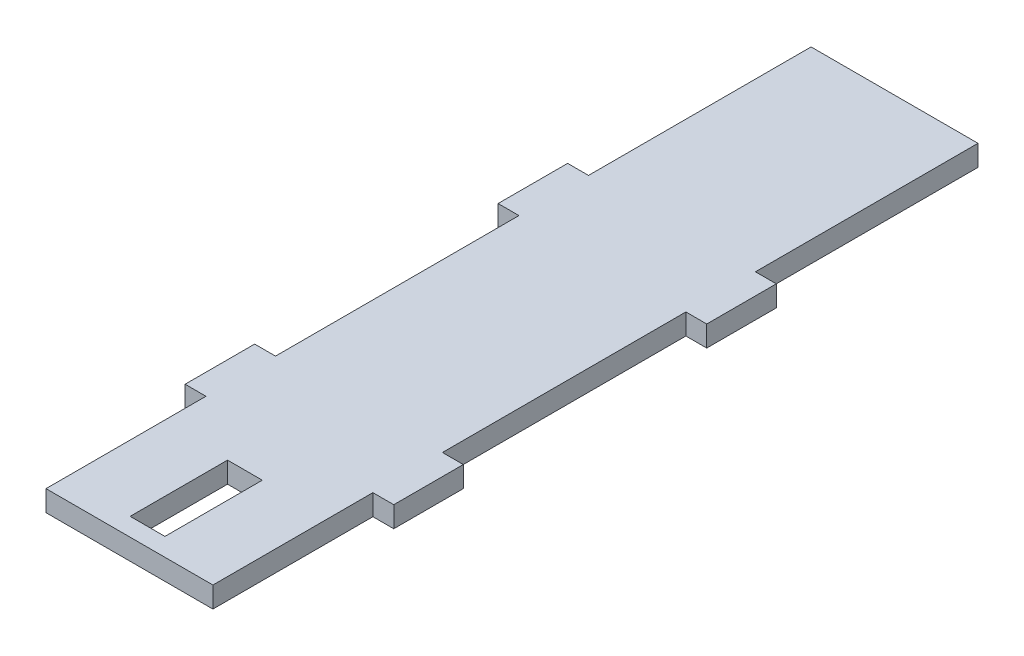
ISO-10303-21;
HEADER;
FILE_DESCRIPTION(('STEP AP214'),'2;1');
FILE_NAME('part.step','',(''),(''),'','','');
FILE_SCHEMA(('AUTOMOTIVE_DESIGN { 1 0 10303 214 1 1 1 1 }'));
ENDSEC;
DATA;
#1=APPLICATION_CONTEXT('core data for automotive mechanical design processes');
#2=APPLICATION_PROTOCOL_DEFINITION('international standard','automotive_design',2000,#1);
#3=PRODUCT_CONTEXT('',#1,'mechanical');
#4=PRODUCT('Part','Part','',(#3));
#5=PRODUCT_RELATED_PRODUCT_CATEGORY('part','',(#4));
#6=PRODUCT_DEFINITION_FORMATION('','',#4);
#7=PRODUCT_DEFINITION_CONTEXT('part definition',#1,'design');
#8=PRODUCT_DEFINITION('design','',#6,#7);
#9=PRODUCT_DEFINITION_SHAPE('','',#8);
#10=(LENGTH_UNIT() NAMED_UNIT(*) SI_UNIT(.MILLI.,.METRE.));
#11=(NAMED_UNIT(*) PLANE_ANGLE_UNIT() SI_UNIT($,.RADIAN.));
#12=(NAMED_UNIT(*) SI_UNIT($,.STERADIAN.) SOLID_ANGLE_UNIT());
#13=UNCERTAINTY_MEASURE_WITH_UNIT(LENGTH_MEASURE(1.E-05),#10,'distance_accuracy_value','');
#14=(GEOMETRIC_REPRESENTATION_CONTEXT(3) GLOBAL_UNCERTAINTY_ASSIGNED_CONTEXT((#13)) GLOBAL_UNIT_ASSIGNED_CONTEXT((#10,
#11,#12)) REPRESENTATION_CONTEXT('',''));
#15=CARTESIAN_POINT('',(0.,0.,0.));
#16=DIRECTION('',(0.,0.,1.));
#17=DIRECTION('',(1.,0.,0.));
#18=AXIS2_PLACEMENT_3D('',#15,#16,#17);
#19=CARTESIAN_POINT('',(12.,3.,-23.));
#20=DIRECTION('',(-1.,0.,0.));
#21=DIRECTION('',(0.,0.,1.));
#22=AXIS2_PLACEMENT_3D('',#19,#20,#21);
#23=PLANE('',#22);
#24=DIRECTION('',(0.,0.,-1.));
#25=VECTOR('',#24,1.);
#26=CARTESIAN_POINT('',(12.,0.,-23.));
#27=LINE('',#26,#25);
#28=CARTESIAN_POINT('',(12.,0.,-23.));
#29=VERTEX_POINT('',#28);
#30=CARTESIAN_POINT('',(12.,0.,-55.));
#31=VERTEX_POINT('',#30);
#32=EDGE_CURVE('E229',#29,#31,#27,.T.);
#33=ORIENTED_EDGE('',*,*,#32,.T.);
#34=DIRECTION('',(0.,-1.,0.));
#35=VECTOR('',#34,1.);
#36=CARTESIAN_POINT('',(12.,3.,-55.));
#37=LINE('',#36,#35);
#38=CARTESIAN_POINT('',(12.,3.,-55.));
#39=VERTEX_POINT('',#38);
#40=EDGE_CURVE('E431',#39,#31,#37,.T.);
#41=ORIENTED_EDGE('',*,*,#40,.F.);
#42=DIRECTION('',(0.,0.,-1.));
#43=VECTOR('',#42,1.);
#44=CARTESIAN_POINT('',(12.,3.,-23.));
#45=LINE('',#44,#43);
#46=CARTESIAN_POINT('',(12.,3.,-23.));
#47=VERTEX_POINT('',#46);
#48=EDGE_CURVE('E234',#47,#39,#45,.T.);
#49=ORIENTED_EDGE('',*,*,#48,.F.);
#50=DIRECTION('',(0.,-1.,0.));
#51=VECTOR('',#50,1.);
#52=CARTESIAN_POINT('',(12.,3.,-23.));
#53=LINE('',#52,#51);
#54=EDGE_CURVE('E296',#47,#29,#53,.T.);
#55=ORIENTED_EDGE('',*,*,#54,.T.);
#56=EDGE_LOOP('',(#33,#41,#49,#55));
#57=FACE_BOUND('',#56,.T.);
#58=ADVANCED_FACE('F38',(#57),#23,.F.);
#59=CARTESIAN_POINT('',(-12.,3.,-55.));
#60=DIRECTION('',(0.,0.,1.));
#61=DIRECTION('',(1.,0.,0.));
#62=AXIS2_PLACEMENT_3D('',#59,#60,#61);
#63=PLANE('',#62);
#64=DIRECTION('',(-1.,0.,0.));
#65=VECTOR('',#64,1.);
#66=CARTESIAN_POINT('',(-12.,0.,-55.));
#67=LINE('',#66,#65);
#68=CARTESIAN_POINT('',(-12.,0.,-55.));
#69=VERTEX_POINT('',#68);
#70=EDGE_CURVE('E300',#31,#69,#67,.T.);
#71=ORIENTED_EDGE('',*,*,#70,.T.);
#72=DIRECTION('',(0.,-1.,0.));
#73=VECTOR('',#72,1.);
#74=CARTESIAN_POINT('',(-12.,3.,-55.));
#75=LINE('',#74,#73);
#76=CARTESIAN_POINT('',(-12.,3.,-55.));
#77=VERTEX_POINT('',#76);
#78=EDGE_CURVE('E427',#77,#69,#75,.T.);
#79=ORIENTED_EDGE('',*,*,#78,.F.);
#80=DIRECTION('',(-1.,0.,0.));
#81=VECTOR('',#80,1.);
#82=CARTESIAN_POINT('',(-12.,3.,-55.));
#83=LINE('',#82,#81);
#84=EDGE_CURVE('E238',#39,#77,#83,.T.);
#85=ORIENTED_EDGE('',*,*,#84,.F.);
#86=ORIENTED_EDGE('',*,*,#40,.T.);
#87=EDGE_LOOP('',(#71,#79,#85,#86));
#88=FACE_BOUND('',#87,.T.);
#89=ADVANCED_FACE('F462',(#88),#63,.F.);
#90=CARTESIAN_POINT('',(-12.,3.,-23.));
#91=DIRECTION('',(1.,0.,0.));
#92=DIRECTION('',(0.,0.,-1.));
#93=AXIS2_PLACEMENT_3D('',#90,#91,#92);
#94=PLANE('',#93);
#95=DIRECTION('',(0.,0.,1.));
#96=VECTOR('',#95,1.);
#97=CARTESIAN_POINT('',(-12.,0.,-23.));
#98=LINE('',#97,#96);
#99=CARTESIAN_POINT('',(-12.,0.,-23.));
#100=VERTEX_POINT('',#99);
#101=EDGE_CURVE('E303',#69,#100,#98,.T.);
#102=ORIENTED_EDGE('',*,*,#101,.T.);
#103=DIRECTION('',(0.,-1.,0.));
#104=VECTOR('',#103,1.);
#105=CARTESIAN_POINT('',(-12.,3.,-23.));
#106=LINE('',#105,#104);
#107=CARTESIAN_POINT('',(-12.,3.,-23.));
#108=VERTEX_POINT('',#107);
#109=EDGE_CURVE('E423',#108,#100,#106,.T.);
#110=ORIENTED_EDGE('',*,*,#109,.F.);
#111=DIRECTION('',(0.,0.,1.));
#112=VECTOR('',#111,1.);
#113=CARTESIAN_POINT('',(-12.,3.,-23.));
#114=LINE('',#113,#112);
#115=EDGE_CURVE('E242',#77,#108,#114,.T.);
#116=ORIENTED_EDGE('',*,*,#115,.F.);
#117=ORIENTED_EDGE('',*,*,#78,.T.);
#118=EDGE_LOOP('',(#102,#110,#116,#117));
#119=FACE_BOUND('',#118,.T.);
#120=ADVANCED_FACE('F467',(#119),#94,.F.);
#121=CARTESIAN_POINT('',(-12.,3.,-23.));
#122=DIRECTION('',(0.,0.,1.));
#123=DIRECTION('',(1.,0.,0.));
#124=AXIS2_PLACEMENT_3D('',#121,#122,#123);
#125=PLANE('',#124);
#126=DIRECTION('',(-1.,0.,0.));
#127=VECTOR('',#126,1.);
#128=CARTESIAN_POINT('',(-12.,0.,-23.));
#129=LINE('',#128,#127);
#130=CARTESIAN_POINT('',(-15.,0.,-23.));
#131=VERTEX_POINT('',#130);
#132=EDGE_CURVE('E306',#100,#131,#129,.T.);
#133=ORIENTED_EDGE('',*,*,#132,.T.);
#134=DIRECTION('',(0.,-1.,0.));
#135=VECTOR('',#134,1.);
#136=CARTESIAN_POINT('',(-15.,3.,-23.));
#137=LINE('',#136,#135);
#138=CARTESIAN_POINT('',(-15.,3.,-23.));
#139=VERTEX_POINT('',#138);
#140=EDGE_CURVE('E419',#139,#131,#137,.T.);
#141=ORIENTED_EDGE('',*,*,#140,.F.);
#142=DIRECTION('',(-1.,0.,0.));
#143=VECTOR('',#142,1.);
#144=CARTESIAN_POINT('',(-12.,3.,-23.));
#145=LINE('',#144,#143);
#146=EDGE_CURVE('E245',#108,#139,#145,.T.);
#147=ORIENTED_EDGE('',*,*,#146,.F.);
#148=ORIENTED_EDGE('',*,*,#109,.T.);
#149=EDGE_LOOP('',(#133,#141,#147,#148));
#150=FACE_BOUND('',#149,.T.);
#151=ADVANCED_FACE('F559',(#150),#125,.F.);
#152=CARTESIAN_POINT('',(-15.,3.,-23.));
#153=DIRECTION('',(1.,0.,0.));
#154=DIRECTION('',(0.,0.,-1.));
#155=AXIS2_PLACEMENT_3D('',#152,#153,#154);
#156=PLANE('',#155);
#157=DIRECTION('',(0.,0.,1.));
#158=VECTOR('',#157,1.);
#159=CARTESIAN_POINT('',(-15.,0.,-23.));
#160=LINE('',#159,#158);
#161=CARTESIAN_POINT('',(-15.,0.,-13.));
#162=VERTEX_POINT('',#161);
#163=EDGE_CURVE('E309',#131,#162,#160,.T.);
#164=ORIENTED_EDGE('',*,*,#163,.T.);
#165=DIRECTION('',(0.,-1.,0.));
#166=VECTOR('',#165,1.);
#167=CARTESIAN_POINT('',(-15.,3.,-13.));
#168=LINE('',#167,#166);
#169=CARTESIAN_POINT('',(-15.,3.,-13.));
#170=VERTEX_POINT('',#169);
#171=EDGE_CURVE('E415',#170,#162,#168,.T.);
#172=ORIENTED_EDGE('',*,*,#171,.F.);
#173=DIRECTION('',(0.,0.,1.));
#174=VECTOR('',#173,1.);
#175=CARTESIAN_POINT('',(-15.,3.,-23.));
#176=LINE('',#175,#174);
#177=EDGE_CURVE('E248',#139,#170,#176,.T.);
#178=ORIENTED_EDGE('',*,*,#177,.F.);
#179=ORIENTED_EDGE('',*,*,#140,.T.);
#180=EDGE_LOOP('',(#164,#172,#178,#179));
#181=FACE_BOUND('',#180,.T.);
#182=ADVANCED_FACE('F555',(#181),#156,.F.);
#183=CARTESIAN_POINT('',(-12.,3.,-13.));
#184=DIRECTION('',(0.,0.,-1.));
#185=DIRECTION('',(-1.,0.,0.));
#186=AXIS2_PLACEMENT_3D('',#183,#184,#185);
#187=PLANE('',#186);
#188=DIRECTION('',(1.,0.,0.));
#189=VECTOR('',#188,1.);
#190=CARTESIAN_POINT('',(-12.,0.,-13.));
#191=LINE('',#190,#189);
#192=CARTESIAN_POINT('',(-12.,0.,-13.));
#193=VERTEX_POINT('',#192);
#194=EDGE_CURVE('E312',#162,#193,#191,.T.);
#195=ORIENTED_EDGE('',*,*,#194,.T.);
#196=DIRECTION('',(0.,-1.,0.));
#197=VECTOR('',#196,1.);
#198=CARTESIAN_POINT('',(-12.,3.,-13.));
#199=LINE('',#198,#197);
#200=CARTESIAN_POINT('',(-12.,3.,-13.));
#201=VERTEX_POINT('',#200);
#202=EDGE_CURVE('E411',#201,#193,#199,.T.);
#203=ORIENTED_EDGE('',*,*,#202,.F.);
#204=DIRECTION('',(1.,0.,0.));
#205=VECTOR('',#204,1.);
#206=CARTESIAN_POINT('',(-12.,3.,-13.));
#207=LINE('',#206,#205);
#208=EDGE_CURVE('E251',#170,#201,#207,.T.);
#209=ORIENTED_EDGE('',*,*,#208,.F.);
#210=ORIENTED_EDGE('',*,*,#171,.T.);
#211=EDGE_LOOP('',(#195,#203,#209,#210));
#212=FACE_BOUND('',#211,.T.);
#213=ADVANCED_FACE('F550',(#212),#187,.F.);
#214=CARTESIAN_POINT('',(-12.,3.,22.));
#215=DIRECTION('',(1.,0.,0.));
#216=DIRECTION('',(0.,0.,-1.));
#217=AXIS2_PLACEMENT_3D('',#214,#215,#216);
#218=PLANE('',#217);
#219=DIRECTION('',(0.,0.,1.));
#220=VECTOR('',#219,1.);
#221=CARTESIAN_POINT('',(-12.,0.,22.));
#222=LINE('',#221,#220);
#223=CARTESIAN_POINT('',(-12.,0.,22.));
#224=VERTEX_POINT('',#223);
#225=EDGE_CURVE('E315',#193,#224,#222,.T.);
#226=ORIENTED_EDGE('',*,*,#225,.T.);
#227=DIRECTION('',(0.,-1.,0.));
#228=VECTOR('',#227,1.);
#229=CARTESIAN_POINT('',(-12.,3.,22.));
#230=LINE('',#229,#228);
#231=CARTESIAN_POINT('',(-12.,3.,22.));
#232=VERTEX_POINT('',#231);
#233=EDGE_CURVE('E407',#232,#224,#230,.T.);
#234=ORIENTED_EDGE('',*,*,#233,.F.);
#235=DIRECTION('',(0.,0.,1.));
#236=VECTOR('',#235,1.);
#237=CARTESIAN_POINT('',(-12.,3.,22.));
#238=LINE('',#237,#236);
#239=EDGE_CURVE('E254',#201,#232,#238,.T.);
#240=ORIENTED_EDGE('',*,*,#239,.F.);
#241=ORIENTED_EDGE('',*,*,#202,.T.);
#242=EDGE_LOOP('',(#226,#234,#240,#241));
#243=FACE_BOUND('',#242,.T.);
#244=ADVANCED_FACE('F545',(#243),#218,.F.);
#245=CARTESIAN_POINT('',(-12.,3.,22.));
#246=DIRECTION('',(0.,0.,1.));
#247=DIRECTION('',(1.,0.,0.));
#248=AXIS2_PLACEMENT_3D('',#245,#246,#247);
#249=PLANE('',#248);
#250=DIRECTION('',(-1.,0.,0.));
#251=VECTOR('',#250,1.);
#252=CARTESIAN_POINT('',(-12.,0.,22.));
#253=LINE('',#252,#251);
#254=CARTESIAN_POINT('',(-15.,0.,22.));
#255=VERTEX_POINT('',#254);
#256=EDGE_CURVE('E318',#224,#255,#253,.T.);
#257=ORIENTED_EDGE('',*,*,#256,.T.);
#258=DIRECTION('',(0.,-1.,0.));
#259=VECTOR('',#258,1.);
#260=CARTESIAN_POINT('',(-15.,3.,22.));
#261=LINE('',#260,#259);
#262=CARTESIAN_POINT('',(-15.,3.,22.));
#263=VERTEX_POINT('',#262);
#264=EDGE_CURVE('E403',#263,#255,#261,.T.);
#265=ORIENTED_EDGE('',*,*,#264,.F.);
#266=DIRECTION('',(-1.,0.,0.));
#267=VECTOR('',#266,1.);
#268=CARTESIAN_POINT('',(-12.,3.,22.));
#269=LINE('',#268,#267);
#270=EDGE_CURVE('E257',#232,#263,#269,.T.);
#271=ORIENTED_EDGE('',*,*,#270,.F.);
#272=ORIENTED_EDGE('',*,*,#233,.T.);
#273=EDGE_LOOP('',(#257,#265,#271,#272));
#274=FACE_BOUND('',#273,.T.);
#275=ADVANCED_FACE('F541',(#274),#249,.F.);
#276=CARTESIAN_POINT('',(-15.,3.,22.));
#277=DIRECTION('',(1.,0.,0.));
#278=DIRECTION('',(0.,0.,-1.));
#279=AXIS2_PLACEMENT_3D('',#276,#277,#278);
#280=PLANE('',#279);
#281=DIRECTION('',(0.,0.,1.));
#282=VECTOR('',#281,1.);
#283=CARTESIAN_POINT('',(-15.,0.,22.));
#284=LINE('',#283,#282);
#285=CARTESIAN_POINT('',(-15.,0.,32.));
#286=VERTEX_POINT('',#285);
#287=EDGE_CURVE('E321',#255,#286,#284,.T.);
#288=ORIENTED_EDGE('',*,*,#287,.T.);
#289=DIRECTION('',(0.,-1.,0.));
#290=VECTOR('',#289,1.);
#291=CARTESIAN_POINT('',(-15.,3.,32.));
#292=LINE('',#291,#290);
#293=CARTESIAN_POINT('',(-15.,3.,32.));
#294=VERTEX_POINT('',#293);
#295=EDGE_CURVE('E399',#294,#286,#292,.T.);
#296=ORIENTED_EDGE('',*,*,#295,.F.);
#297=DIRECTION('',(0.,0.,1.));
#298=VECTOR('',#297,1.);
#299=CARTESIAN_POINT('',(-15.,3.,22.));
#300=LINE('',#299,#298);
#301=EDGE_CURVE('E260',#263,#294,#300,.T.);
#302=ORIENTED_EDGE('',*,*,#301,.F.);
#303=ORIENTED_EDGE('',*,*,#264,.T.);
#304=EDGE_LOOP('',(#288,#296,#302,#303));
#305=FACE_BOUND('',#304,.T.);
#306=ADVANCED_FACE('F536',(#305),#280,.F.);
#307=CARTESIAN_POINT('',(-12.,3.,32.));
#308=DIRECTION('',(0.,0.,-1.));
#309=DIRECTION('',(-1.,0.,0.));
#310=AXIS2_PLACEMENT_3D('',#307,#308,#309);
#311=PLANE('',#310);
#312=DIRECTION('',(1.,0.,0.));
#313=VECTOR('',#312,1.);
#314=CARTESIAN_POINT('',(-12.,0.,32.));
#315=LINE('',#314,#313);
#316=CARTESIAN_POINT('',(-12.,0.,32.));
#317=VERTEX_POINT('',#316);
#318=EDGE_CURVE('E324',#286,#317,#315,.T.);
#319=ORIENTED_EDGE('',*,*,#318,.T.);
#320=DIRECTION('',(0.,-1.,0.));
#321=VECTOR('',#320,1.);
#322=CARTESIAN_POINT('',(-12.,3.,32.));
#323=LINE('',#322,#321);
#324=CARTESIAN_POINT('',(-12.,3.,32.));
#325=VERTEX_POINT('',#324);
#326=EDGE_CURVE('E395',#325,#317,#323,.T.);
#327=ORIENTED_EDGE('',*,*,#326,.F.);
#328=DIRECTION('',(1.,0.,0.));
#329=VECTOR('',#328,1.);
#330=CARTESIAN_POINT('',(-12.,3.,32.));
#331=LINE('',#330,#329);
#332=EDGE_CURVE('E263',#294,#325,#331,.T.);
#333=ORIENTED_EDGE('',*,*,#332,.F.);
#334=ORIENTED_EDGE('',*,*,#295,.T.);
#335=EDGE_LOOP('',(#319,#327,#333,#334));
#336=FACE_BOUND('',#335,.T.);
#337=ADVANCED_FACE('F530',(#336),#311,.F.);
#338=CARTESIAN_POINT('',(-12.,3.,55.));
#339=DIRECTION('',(1.,0.,0.));
#340=DIRECTION('',(0.,0.,-1.));
#341=AXIS2_PLACEMENT_3D('',#338,#339,#340);
#342=PLANE('',#341);
#343=DIRECTION('',(0.,0.,1.));
#344=VECTOR('',#343,1.);
#345=CARTESIAN_POINT('',(-12.,0.,55.));
#346=LINE('',#345,#344);
#347=CARTESIAN_POINT('',(-12.,0.,55.));
#348=VERTEX_POINT('',#347);
#349=EDGE_CURVE('E327',#317,#348,#346,.T.);
#350=ORIENTED_EDGE('',*,*,#349,.T.);
#351=DIRECTION('',(0.,-1.,0.));
#352=VECTOR('',#351,1.);
#353=CARTESIAN_POINT('',(-12.,3.,55.));
#354=LINE('',#353,#352);
#355=CARTESIAN_POINT('',(-12.,3.,55.));
#356=VERTEX_POINT('',#355);
#357=EDGE_CURVE('E391',#356,#348,#354,.T.);
#358=ORIENTED_EDGE('',*,*,#357,.F.);
#359=DIRECTION('',(0.,0.,1.));
#360=VECTOR('',#359,1.);
#361=CARTESIAN_POINT('',(-12.,3.,55.));
#362=LINE('',#361,#360);
#363=EDGE_CURVE('E266',#325,#356,#362,.T.);
#364=ORIENTED_EDGE('',*,*,#363,.F.);
#365=ORIENTED_EDGE('',*,*,#326,.T.);
#366=EDGE_LOOP('',(#350,#358,#364,#365));
#367=FACE_BOUND('',#366,.T.);
#368=ADVANCED_FACE('F526',(#367),#342,.F.);
#369=CARTESIAN_POINT('',(-12.,3.,55.));
#370=DIRECTION('',(0.,0.,-1.));
#371=DIRECTION('',(-1.,0.,0.));
#372=AXIS2_PLACEMENT_3D('',#369,#370,#371);
#373=PLANE('',#372);
#374=DIRECTION('',(1.,0.,0.));
#375=VECTOR('',#374,1.);
#376=CARTESIAN_POINT('',(-12.,0.,55.));
#377=LINE('',#376,#375);
#378=CARTESIAN_POINT('',(12.,0.,55.));
#379=VERTEX_POINT('',#378);
#380=EDGE_CURVE('E330',#348,#379,#377,.T.);
#381=ORIENTED_EDGE('',*,*,#380,.T.);
#382=DIRECTION('',(0.,-1.,0.));
#383=VECTOR('',#382,1.);
#384=CARTESIAN_POINT('',(12.,3.,55.));
#385=LINE('',#384,#383);
#386=CARTESIAN_POINT('',(12.,3.,55.));
#387=VERTEX_POINT('',#386);
#388=EDGE_CURVE('E387',#387,#379,#385,.T.);
#389=ORIENTED_EDGE('',*,*,#388,.F.);
#390=DIRECTION('',(1.,0.,0.));
#391=VECTOR('',#390,1.);
#392=CARTESIAN_POINT('',(-12.,3.,55.));
#393=LINE('',#392,#391);
#394=EDGE_CURVE('E269',#356,#387,#393,.T.);
#395=ORIENTED_EDGE('',*,*,#394,.F.);
#396=ORIENTED_EDGE('',*,*,#357,.T.);
#397=EDGE_LOOP('',(#381,#389,#395,#396));
#398=FACE_BOUND('',#397,.T.);
#399=ADVANCED_FACE('F521',(#398),#373,.F.);
#400=CARTESIAN_POINT('',(12.,3.,55.));
#401=DIRECTION('',(-1.,0.,0.));
#402=DIRECTION('',(0.,0.,1.));
#403=AXIS2_PLACEMENT_3D('',#400,#401,#402);
#404=PLANE('',#403);
#405=DIRECTION('',(0.,0.,-1.));
#406=VECTOR('',#405,1.);
#407=CARTESIAN_POINT('',(12.,0.,55.));
#408=LINE('',#407,#406);
#409=CARTESIAN_POINT('',(12.,0.,32.));
#410=VERTEX_POINT('',#409);
#411=EDGE_CURVE('E333',#379,#410,#408,.T.);
#412=ORIENTED_EDGE('',*,*,#411,.T.);
#413=DIRECTION('',(0.,-1.,0.));
#414=VECTOR('',#413,1.);
#415=CARTESIAN_POINT('',(12.,3.,32.));
#416=LINE('',#415,#414);
#417=CARTESIAN_POINT('',(12.,3.,32.));
#418=VERTEX_POINT('',#417);
#419=EDGE_CURVE('E383',#418,#410,#416,.T.);
#420=ORIENTED_EDGE('',*,*,#419,.F.);
#421=DIRECTION('',(0.,0.,-1.));
#422=VECTOR('',#421,1.);
#423=CARTESIAN_POINT('',(12.,3.,55.));
#424=LINE('',#423,#422);
#425=EDGE_CURVE('E272',#387,#418,#424,.T.);
#426=ORIENTED_EDGE('',*,*,#425,.F.);
#427=ORIENTED_EDGE('',*,*,#388,.T.);
#428=EDGE_LOOP('',(#412,#420,#426,#427));
#429=FACE_BOUND('',#428,.T.);
#430=ADVANCED_FACE('F515',(#429),#404,.F.);
#431=CARTESIAN_POINT('',(12.,3.,32.));
#432=DIRECTION('',(0.,0.,-1.));
#433=DIRECTION('',(-1.,0.,0.));
#434=AXIS2_PLACEMENT_3D('',#431,#432,#433);
#435=PLANE('',#434);
#436=DIRECTION('',(1.,0.,0.));
#437=VECTOR('',#436,1.);
#438=CARTESIAN_POINT('',(12.,0.,32.));
#439=LINE('',#438,#437);
#440=CARTESIAN_POINT('',(15.,0.,32.));
#441=VERTEX_POINT('',#440);
#442=EDGE_CURVE('E336',#410,#441,#439,.T.);
#443=ORIENTED_EDGE('',*,*,#442,.T.);
#444=DIRECTION('',(0.,-1.,0.));
#445=VECTOR('',#444,1.);
#446=CARTESIAN_POINT('',(15.,3.,32.));
#447=LINE('',#446,#445);
#448=CARTESIAN_POINT('',(15.,3.,32.));
#449=VERTEX_POINT('',#448);
#450=EDGE_CURVE('E379',#449,#441,#447,.T.);
#451=ORIENTED_EDGE('',*,*,#450,.F.);
#452=DIRECTION('',(1.,0.,0.));
#453=VECTOR('',#452,1.);
#454=CARTESIAN_POINT('',(12.,3.,32.));
#455=LINE('',#454,#453);
#456=EDGE_CURVE('E275',#418,#449,#455,.T.);
#457=ORIENTED_EDGE('',*,*,#456,.F.);
#458=ORIENTED_EDGE('',*,*,#419,.T.);
#459=EDGE_LOOP('',(#443,#451,#457,#458));
#460=FACE_BOUND('',#459,.T.);
#461=ADVANCED_FACE('F511',(#460),#435,.F.);
#462=CARTESIAN_POINT('',(15.,3.,22.));
#463=DIRECTION('',(-1.,0.,0.));
#464=DIRECTION('',(0.,0.,1.));
#465=AXIS2_PLACEMENT_3D('',#462,#463,#464);
#466=PLANE('',#465);
#467=DIRECTION('',(0.,0.,-1.));
#468=VECTOR('',#467,1.);
#469=CARTESIAN_POINT('',(15.,0.,22.));
#470=LINE('',#469,#468);
#471=CARTESIAN_POINT('',(15.,0.,22.));
#472=VERTEX_POINT('',#471);
#473=EDGE_CURVE('E339',#441,#472,#470,.T.);
#474=ORIENTED_EDGE('',*,*,#473,.T.);
#475=DIRECTION('',(0.,-1.,0.));
#476=VECTOR('',#475,1.);
#477=CARTESIAN_POINT('',(15.,3.,22.));
#478=LINE('',#477,#476);
#479=CARTESIAN_POINT('',(15.,3.,22.));
#480=VERTEX_POINT('',#479);
#481=EDGE_CURVE('E375',#480,#472,#478,.T.);
#482=ORIENTED_EDGE('',*,*,#481,.F.);
#483=DIRECTION('',(0.,0.,-1.));
#484=VECTOR('',#483,1.);
#485=CARTESIAN_POINT('',(15.,3.,22.));
#486=LINE('',#485,#484);
#487=EDGE_CURVE('E278',#449,#480,#486,.T.);
#488=ORIENTED_EDGE('',*,*,#487,.F.);
#489=ORIENTED_EDGE('',*,*,#450,.T.);
#490=EDGE_LOOP('',(#474,#482,#488,#489));
#491=FACE_BOUND('',#490,.T.);
#492=ADVANCED_FACE('F506',(#491),#466,.F.);
#493=CARTESIAN_POINT('',(12.,3.,22.));
#494=DIRECTION('',(0.,0.,1.));
#495=DIRECTION('',(1.,0.,0.));
#496=AXIS2_PLACEMENT_3D('',#493,#494,#495);
#497=PLANE('',#496);
#498=DIRECTION('',(-1.,0.,0.));
#499=VECTOR('',#498,1.);
#500=CARTESIAN_POINT('',(12.,0.,22.));
#501=LINE('',#500,#499);
#502=CARTESIAN_POINT('',(12.,0.,22.));
#503=VERTEX_POINT('',#502);
#504=EDGE_CURVE('E342',#472,#503,#501,.T.);
#505=ORIENTED_EDGE('',*,*,#504,.T.);
#506=DIRECTION('',(0.,-1.,0.));
#507=VECTOR('',#506,1.);
#508=CARTESIAN_POINT('',(12.,3.,22.));
#509=LINE('',#508,#507);
#510=CARTESIAN_POINT('',(12.,3.,22.));
#511=VERTEX_POINT('',#510);
#512=EDGE_CURVE('E371',#511,#503,#509,.T.);
#513=ORIENTED_EDGE('',*,*,#512,.F.);
#514=DIRECTION('',(-1.,0.,0.));
#515=VECTOR('',#514,1.);
#516=CARTESIAN_POINT('',(12.,3.,22.));
#517=LINE('',#516,#515);
#518=EDGE_CURVE('E281',#480,#511,#517,.T.);
#519=ORIENTED_EDGE('',*,*,#518,.F.);
#520=ORIENTED_EDGE('',*,*,#481,.T.);
#521=EDGE_LOOP('',(#505,#513,#519,#520));
#522=FACE_BOUND('',#521,.T.);
#523=ADVANCED_FACE('F500',(#522),#497,.F.);
#524=CARTESIAN_POINT('',(12.,3.,22.));
#525=DIRECTION('',(-1.,0.,0.));
#526=DIRECTION('',(0.,0.,1.));
#527=AXIS2_PLACEMENT_3D('',#524,#525,#526);
#528=PLANE('',#527);
#529=DIRECTION('',(0.,0.,-1.));
#530=VECTOR('',#529,1.);
#531=CARTESIAN_POINT('',(12.,0.,22.));
#532=LINE('',#531,#530);
#533=CARTESIAN_POINT('',(12.,0.,-13.));
#534=VERTEX_POINT('',#533);
#535=EDGE_CURVE('E345',#503,#534,#532,.T.);
#536=ORIENTED_EDGE('',*,*,#535,.T.);
#537=DIRECTION('',(0.,-1.,0.));
#538=VECTOR('',#537,1.);
#539=CARTESIAN_POINT('',(12.,3.,-13.));
#540=LINE('',#539,#538);
#541=CARTESIAN_POINT('',(12.,3.,-13.));
#542=VERTEX_POINT('',#541);
#543=EDGE_CURVE('E367',#542,#534,#540,.T.);
#544=ORIENTED_EDGE('',*,*,#543,.F.);
#545=DIRECTION('',(0.,0.,-1.));
#546=VECTOR('',#545,1.);
#547=CARTESIAN_POINT('',(12.,3.,22.));
#548=LINE('',#547,#546);
#549=EDGE_CURVE('E284',#511,#542,#548,.T.);
#550=ORIENTED_EDGE('',*,*,#549,.F.);
#551=ORIENTED_EDGE('',*,*,#512,.T.);
#552=EDGE_LOOP('',(#536,#544,#550,#551));
#553=FACE_BOUND('',#552,.T.);
#554=ADVANCED_FACE('F496',(#553),#528,.F.);
#555=CARTESIAN_POINT('',(12.,3.,-13.));
#556=DIRECTION('',(0.,0.,-1.));
#557=DIRECTION('',(-1.,0.,0.));
#558=AXIS2_PLACEMENT_3D('',#555,#556,#557);
#559=PLANE('',#558);
#560=DIRECTION('',(1.,0.,0.));
#561=VECTOR('',#560,1.);
#562=CARTESIAN_POINT('',(12.,0.,-13.));
#563=LINE('',#562,#561);
#564=CARTESIAN_POINT('',(15.,0.,-13.));
#565=VERTEX_POINT('',#564);
#566=EDGE_CURVE('E348',#534,#565,#563,.T.);
#567=ORIENTED_EDGE('',*,*,#566,.T.);
#568=DIRECTION('',(0.,-1.,0.));
#569=VECTOR('',#568,1.);
#570=CARTESIAN_POINT('',(15.,3.,-13.));
#571=LINE('',#570,#569);
#572=CARTESIAN_POINT('',(15.,3.,-13.));
#573=VERTEX_POINT('',#572);
#574=EDGE_CURVE('E363',#573,#565,#571,.T.);
#575=ORIENTED_EDGE('',*,*,#574,.F.);
#576=DIRECTION('',(1.,0.,0.));
#577=VECTOR('',#576,1.);
#578=CARTESIAN_POINT('',(12.,3.,-13.));
#579=LINE('',#578,#577);
#580=EDGE_CURVE('E287',#542,#573,#579,.T.);
#581=ORIENTED_EDGE('',*,*,#580,.F.);
#582=ORIENTED_EDGE('',*,*,#543,.T.);
#583=EDGE_LOOP('',(#567,#575,#581,#582));
#584=FACE_BOUND('',#583,.T.);
#585=ADVANCED_FACE('F491',(#584),#559,.F.);
#586=CARTESIAN_POINT('',(15.,3.,-23.));
#587=DIRECTION('',(-1.,0.,0.));
#588=DIRECTION('',(0.,0.,1.));
#589=AXIS2_PLACEMENT_3D('',#586,#587,#588);
#590=PLANE('',#589);
#591=DIRECTION('',(0.,0.,-1.));
#592=VECTOR('',#591,1.);
#593=CARTESIAN_POINT('',(15.,0.,-23.));
#594=LINE('',#593,#592);
#595=CARTESIAN_POINT('',(15.,0.,-23.));
#596=VERTEX_POINT('',#595);
#597=EDGE_CURVE('E351',#565,#596,#594,.T.);
#598=ORIENTED_EDGE('',*,*,#597,.T.);
#599=DIRECTION('',(0.,-1.,0.));
#600=VECTOR('',#599,1.);
#601=CARTESIAN_POINT('',(15.,3.,-23.));
#602=LINE('',#601,#600);
#603=CARTESIAN_POINT('',(15.,3.,-23.));
#604=VERTEX_POINT('',#603);
#605=EDGE_CURVE('E359',#604,#596,#602,.T.);
#606=ORIENTED_EDGE('',*,*,#605,.F.);
#607=DIRECTION('',(0.,0.,-1.));
#608=VECTOR('',#607,1.);
#609=CARTESIAN_POINT('',(15.,3.,-23.));
#610=LINE('',#609,#608);
#611=EDGE_CURVE('E290',#573,#604,#610,.T.);
#612=ORIENTED_EDGE('',*,*,#611,.F.);
#613=ORIENTED_EDGE('',*,*,#574,.T.);
#614=EDGE_LOOP('',(#598,#606,#612,#613));
#615=FACE_BOUND('',#614,.T.);
#616=ADVANCED_FACE('F485',(#615),#590,.F.);
#617=CARTESIAN_POINT('',(12.,3.,-23.));
#618=DIRECTION('',(0.,0.,1.));
#619=DIRECTION('',(1.,0.,0.));
#620=AXIS2_PLACEMENT_3D('',#617,#618,#619);
#621=PLANE('',#620);
#622=DIRECTION('',(-1.,0.,0.));
#623=VECTOR('',#622,1.);
#624=CARTESIAN_POINT('',(12.,0.,-23.));
#625=LINE('',#624,#623);
#626=EDGE_CURVE('E239',#596,#29,#625,.T.);
#627=ORIENTED_EDGE('',*,*,#626,.T.);
#628=ORIENTED_EDGE('',*,*,#54,.F.);
#629=DIRECTION('',(-1.,0.,0.));
#630=VECTOR('',#629,1.);
#631=CARTESIAN_POINT('',(12.,3.,-23.));
#632=LINE('',#631,#630);
#633=EDGE_CURVE('E293',#604,#47,#632,.T.);
#634=ORIENTED_EDGE('',*,*,#633,.F.);
#635=ORIENTED_EDGE('',*,*,#605,.T.);
#636=EDGE_LOOP('',(#627,#628,#634,#635));
#637=FACE_BOUND('',#636,.T.);
#638=ADVANCED_FACE('F483',(#637),#621,.F.);
#639=CARTESIAN_POINT('',(0.,3.,0.));
#640=DIRECTION('',(0.,-1.,0.));
#641=DIRECTION('',(0.,0.,-1.));
#642=AXIS2_PLACEMENT_3D('',#639,#640,#641);
#643=PLANE('',#642);
#644=DIRECTION('',(1.,0.,0.));
#645=VECTOR('',#644,1.);
#646=CARTESIAN_POINT('',(-2.5,3.,52.4));
#647=LINE('',#646,#645);
#648=CARTESIAN_POINT('',(-2.5,3.,52.4));
#649=VERTEX_POINT('',#648);
#650=CARTESIAN_POINT('',(2.5,3.,52.4));
#651=VERTEX_POINT('',#650);
#652=EDGE_CURVE('E211',#649,#651,#647,.T.);
#653=ORIENTED_EDGE('',*,*,#652,.F.);
#654=DIRECTION('',(0.,0.,1.));
#655=VECTOR('',#654,1.);
#656=CARTESIAN_POINT('',(-2.5,3.,52.4));
#657=LINE('',#656,#655);
#658=CARTESIAN_POINT('',(-2.5,3.,38.4));
#659=VERTEX_POINT('',#658);
#660=EDGE_CURVE('E53',#659,#649,#657,.T.);
#661=ORIENTED_EDGE('',*,*,#660,.F.);
#662=DIRECTION('',(-1.,0.,0.));
#663=VECTOR('',#662,1.);
#664=CARTESIAN_POINT('',(-2.5,3.,38.4));
#665=LINE('',#664,#663);
#666=CARTESIAN_POINT('',(2.5,3.,38.4));
#667=VERTEX_POINT('',#666);
#668=EDGE_CURVE('E219',#667,#659,#665,.T.);
#669=ORIENTED_EDGE('',*,*,#668,.F.);
#670=DIRECTION('',(0.,0.,-1.));
#671=VECTOR('',#670,1.);
#672=CARTESIAN_POINT('',(2.5,3.,52.4));
#673=LINE('',#672,#671);
#674=EDGE_CURVE('E201',#651,#667,#673,.T.);
#675=ORIENTED_EDGE('',*,*,#674,.F.);
#676=EDGE_LOOP('',(#653,#661,#669,#675));
#677=FACE_BOUND('',#676,.T.);
#678=ORIENTED_EDGE('',*,*,#48,.T.);
#679=ORIENTED_EDGE('',*,*,#84,.T.);
#680=ORIENTED_EDGE('',*,*,#115,.T.);
#681=ORIENTED_EDGE('',*,*,#146,.T.);
#682=ORIENTED_EDGE('',*,*,#177,.T.);
#683=ORIENTED_EDGE('',*,*,#208,.T.);
#684=ORIENTED_EDGE('',*,*,#239,.T.);
#685=ORIENTED_EDGE('',*,*,#270,.T.);
#686=ORIENTED_EDGE('',*,*,#301,.T.);
#687=ORIENTED_EDGE('',*,*,#332,.T.);
#688=ORIENTED_EDGE('',*,*,#363,.T.);
#689=ORIENTED_EDGE('',*,*,#394,.T.);
#690=ORIENTED_EDGE('',*,*,#425,.T.);
#691=ORIENTED_EDGE('',*,*,#456,.T.);
#692=ORIENTED_EDGE('',*,*,#487,.T.);
#693=ORIENTED_EDGE('',*,*,#518,.T.);
#694=ORIENTED_EDGE('',*,*,#549,.T.);
#695=ORIENTED_EDGE('',*,*,#580,.T.);
#696=ORIENTED_EDGE('',*,*,#611,.T.);
#697=ORIENTED_EDGE('',*,*,#633,.T.);
#698=EDGE_LOOP('',(#678,#679,#680,#681,#682,#683,#684,#685,#686,#687,#688,#689,#690,#691,#692,
#693,#694,#695,#696,#697));
#699=FACE_BOUND('',#698,.T.);
#700=ADVANCED_FACE('F216',(#677,#699),#643,.F.);
#701=CARTESIAN_POINT('',(0.,0.,0.));
#702=DIRECTION('',(0.,-1.,0.));
#703=DIRECTION('',(0.,0.,-1.));
#704=AXIS2_PLACEMENT_3D('',#701,#702,#703);
#705=PLANE('',#704);
#706=DIRECTION('',(0.,0.,-1.));
#707=VECTOR('',#706,1.);
#708=CARTESIAN_POINT('',(-2.5,0.,0.));
#709=LINE('',#708,#707);
#710=CARTESIAN_POINT('',(-2.5,0.,52.4));
#711=VERTEX_POINT('',#710);
#712=CARTESIAN_POINT('',(-2.5,0.,38.4));
#713=VERTEX_POINT('',#712);
#714=EDGE_CURVE('E11',#711,#713,#709,.T.);
#715=ORIENTED_EDGE('',*,*,#714,.F.);
#716=DIRECTION('',(-1.,0.,0.));
#717=VECTOR('',#716,1.);
#718=CARTESIAN_POINT('',(0.,0.,52.4));
#719=LINE('',#718,#717);
#720=CARTESIAN_POINT('',(2.5,0.,52.4));
#721=VERTEX_POINT('',#720);
#722=EDGE_CURVE('E435',#721,#711,#719,.T.);
#723=ORIENTED_EDGE('',*,*,#722,.F.);
#724=DIRECTION('',(0.,0.,1.));
#725=VECTOR('',#724,1.);
#726=CARTESIAN_POINT('',(2.5,0.,0.));
#727=LINE('',#726,#725);
#728=CARTESIAN_POINT('',(2.5,0.,38.4));
#729=VERTEX_POINT('',#728);
#730=EDGE_CURVE('E204',#729,#721,#727,.T.);
#731=ORIENTED_EDGE('',*,*,#730,.F.);
#732=DIRECTION('',(1.,0.,0.));
#733=VECTOR('',#732,1.);
#734=CARTESIAN_POINT('',(0.,0.,38.4));
#735=LINE('',#734,#733);
#736=EDGE_CURVE('E46',#713,#729,#735,.T.);
#737=ORIENTED_EDGE('',*,*,#736,.F.);
#738=EDGE_LOOP('',(#715,#723,#731,#737));
#739=FACE_BOUND('',#738,.T.);
#740=ORIENTED_EDGE('',*,*,#32,.F.);
#741=ORIENTED_EDGE('',*,*,#626,.F.);
#742=ORIENTED_EDGE('',*,*,#597,.F.);
#743=ORIENTED_EDGE('',*,*,#566,.F.);
#744=ORIENTED_EDGE('',*,*,#535,.F.);
#745=ORIENTED_EDGE('',*,*,#504,.F.);
#746=ORIENTED_EDGE('',*,*,#473,.F.);
#747=ORIENTED_EDGE('',*,*,#442,.F.);
#748=ORIENTED_EDGE('',*,*,#411,.F.);
#749=ORIENTED_EDGE('',*,*,#380,.F.);
#750=ORIENTED_EDGE('',*,*,#349,.F.);
#751=ORIENTED_EDGE('',*,*,#318,.F.);
#752=ORIENTED_EDGE('',*,*,#287,.F.);
#753=ORIENTED_EDGE('',*,*,#256,.F.);
#754=ORIENTED_EDGE('',*,*,#225,.F.);
#755=ORIENTED_EDGE('',*,*,#194,.F.);
#756=ORIENTED_EDGE('',*,*,#163,.F.);
#757=ORIENTED_EDGE('',*,*,#132,.F.);
#758=ORIENTED_EDGE('',*,*,#101,.F.);
#759=ORIENTED_EDGE('',*,*,#70,.F.);
#760=EDGE_LOOP('',(#740,#741,#742,#743,#744,#745,#746,#747,#748,#749,#750,#751,#752,#753,#754,
#755,#756,#757,#758,#759));
#761=FACE_BOUND('',#760,.T.);
#762=ADVANCED_FACE('F446',(#739,#761),#705,.T.);
#763=CARTESIAN_POINT('',(-2.5,-7.,52.4));
#764=DIRECTION('',(-1.,0.,0.));
#765=DIRECTION('',(0.,0.,1.));
#766=AXIS2_PLACEMENT_3D('',#763,#764,#765);
#767=PLANE('',#766);
#768=ORIENTED_EDGE('',*,*,#714,.T.);
#769=DIRECTION('',(0.,1.,0.));
#770=VECTOR('',#769,1.);
#771=CARTESIAN_POINT('',(-2.5,-7.,38.4));
#772=LINE('',#771,#770);
#773=EDGE_CURVE('E226',#713,#659,#772,.T.);
#774=ORIENTED_EDGE('',*,*,#773,.T.);
#775=ORIENTED_EDGE('',*,*,#660,.T.);
#776=DIRECTION('',(0.,1.,0.));
#777=VECTOR('',#776,1.);
#778=CARTESIAN_POINT('',(-2.5,-7.,52.4));
#779=LINE('',#778,#777);
#780=EDGE_CURVE('E208',#711,#649,#779,.T.);
#781=ORIENTED_EDGE('',*,*,#780,.F.);
#782=EDGE_LOOP('',(#768,#774,#775,#781));
#783=FACE_BOUND('',#782,.T.);
#784=ADVANCED_FACE('F448',(#783),#767,.F.);
#785=CARTESIAN_POINT('',(-2.5,-7.,38.4));
#786=DIRECTION('',(0.,0.,-1.));
#787=DIRECTION('',(-1.,0.,0.));
#788=AXIS2_PLACEMENT_3D('',#785,#786,#787);
#789=PLANE('',#788);
#790=ORIENTED_EDGE('',*,*,#736,.T.);
#791=DIRECTION('',(0.,1.,0.));
#792=VECTOR('',#791,1.);
#793=CARTESIAN_POINT('',(2.5,-7.,38.4));
#794=LINE('',#793,#792);
#795=EDGE_CURVE('E207',#729,#667,#794,.T.);
#796=ORIENTED_EDGE('',*,*,#795,.T.);
#797=ORIENTED_EDGE('',*,*,#668,.T.);
#798=ORIENTED_EDGE('',*,*,#773,.F.);
#799=EDGE_LOOP('',(#790,#796,#797,#798));
#800=FACE_BOUND('',#799,.T.);
#801=ADVANCED_FACE('F443',(#800),#789,.F.);
#802=CARTESIAN_POINT('',(2.5,-7.,52.4));
#803=DIRECTION('',(1.,0.,0.));
#804=DIRECTION('',(0.,0.,-1.));
#805=AXIS2_PLACEMENT_3D('',#802,#803,#804);
#806=PLANE('',#805);
#807=ORIENTED_EDGE('',*,*,#730,.T.);
#808=DIRECTION('',(0.,1.,0.));
#809=VECTOR('',#808,1.);
#810=CARTESIAN_POINT('',(2.5,-7.,52.4));
#811=LINE('',#810,#809);
#812=EDGE_CURVE('E61',#721,#651,#811,.T.);
#813=ORIENTED_EDGE('',*,*,#812,.T.);
#814=ORIENTED_EDGE('',*,*,#674,.T.);
#815=ORIENTED_EDGE('',*,*,#795,.F.);
#816=EDGE_LOOP('',(#807,#813,#814,#815));
#817=FACE_BOUND('',#816,.T.);
#818=ADVANCED_FACE('F198',(#817),#806,.F.);
#819=CARTESIAN_POINT('',(-2.5,-7.,52.4));
#820=DIRECTION('',(0.,0.,1.));
#821=DIRECTION('',(1.,0.,0.));
#822=AXIS2_PLACEMENT_3D('',#819,#820,#821);
#823=PLANE('',#822);
#824=ORIENTED_EDGE('',*,*,#722,.T.);
#825=ORIENTED_EDGE('',*,*,#780,.T.);
#826=ORIENTED_EDGE('',*,*,#652,.T.);
#827=ORIENTED_EDGE('',*,*,#812,.F.);
#828=EDGE_LOOP('',(#824,#825,#826,#827));
#829=FACE_BOUND('',#828,.T.);
#830=ADVANCED_FACE('F212',(#829),#823,.F.);
#831=CLOSED_SHELL('',(#58,#89,#120,#151,#182,#213,#244,#275,#306,#337,#368,#399,#430,#461,#492,
#523,#554,#585,#616,#638,#700,#762,#784,#801,#818,#830));
#832=MANIFOLD_SOLID_BREP('B2',#831);
#833=ADVANCED_BREP_SHAPE_REPRESENTATION('',(#18,#832),#14);
#834=SHAPE_DEFINITION_REPRESENTATION(#9,#833);
ENDSEC;
END-ISO-10303-21;
